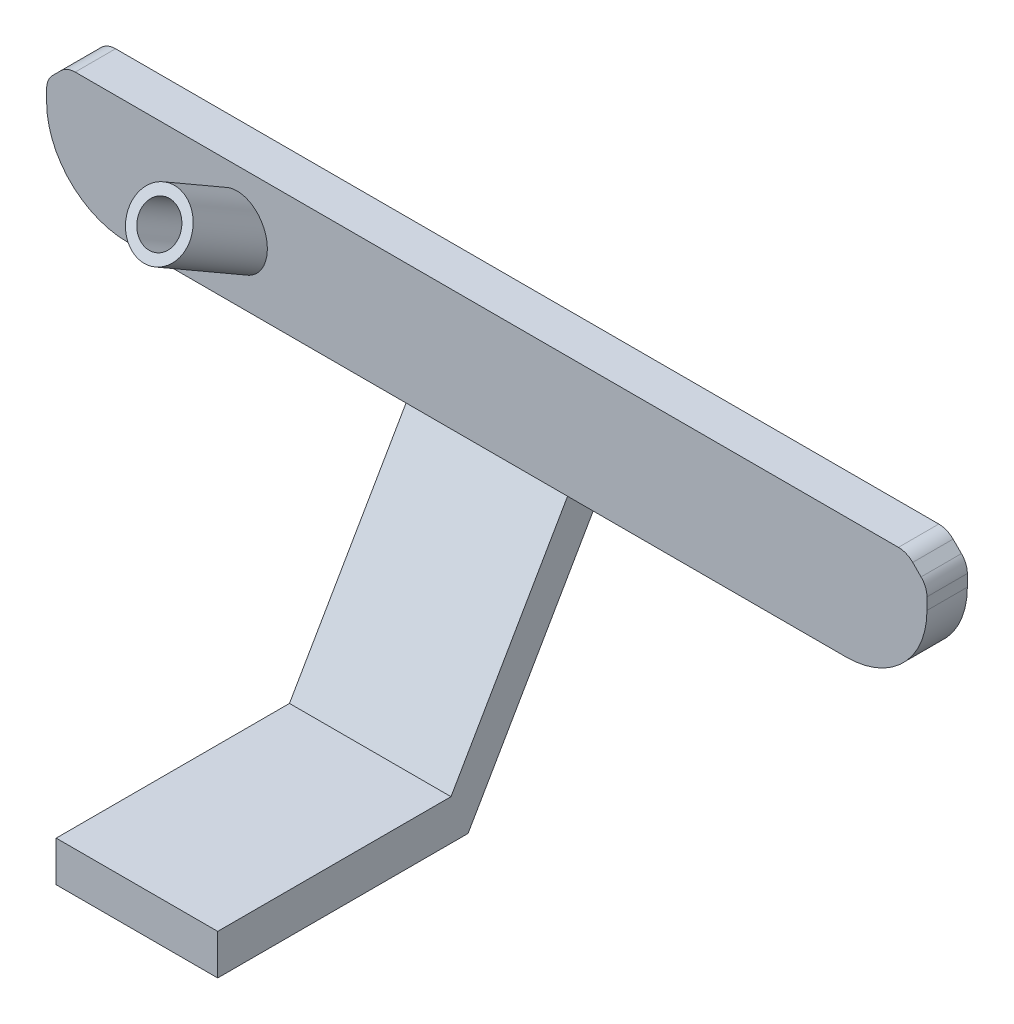
ISO-10303-21;
HEADER;
FILE_DESCRIPTION(('STEP AP214'),'2;1');
FILE_NAME('part.step','',(''),(''),'','','');
FILE_SCHEMA(('AUTOMOTIVE_DESIGN { 1 0 10303 214 1 1 1 1 }'));
ENDSEC;
DATA;
#1=APPLICATION_CONTEXT('core data for automotive mechanical design processes');
#2=APPLICATION_PROTOCOL_DEFINITION('international standard','automotive_design',2000,#1);
#3=PRODUCT_CONTEXT('',#1,'mechanical');
#4=PRODUCT('Part','Part','',(#3));
#5=PRODUCT_RELATED_PRODUCT_CATEGORY('part','',(#4));
#6=PRODUCT_DEFINITION_FORMATION('','',#4);
#7=PRODUCT_DEFINITION_CONTEXT('part definition',#1,'design');
#8=PRODUCT_DEFINITION('design','',#6,#7);
#9=PRODUCT_DEFINITION_SHAPE('','',#8);
#10=(LENGTH_UNIT() NAMED_UNIT(*) SI_UNIT(.MILLI.,.METRE.));
#11=(NAMED_UNIT(*) PLANE_ANGLE_UNIT() SI_UNIT($,.RADIAN.));
#12=(NAMED_UNIT(*) SI_UNIT($,.STERADIAN.) SOLID_ANGLE_UNIT());
#13=UNCERTAINTY_MEASURE_WITH_UNIT(LENGTH_MEASURE(1.E-05),#10,'distance_accuracy_value','');
#14=(GEOMETRIC_REPRESENTATION_CONTEXT(3) GLOBAL_UNCERTAINTY_ASSIGNED_CONTEXT((#13)) GLOBAL_UNIT_ASSIGNED_CONTEXT((#10,
#11,#12)) REPRESENTATION_CONTEXT('',''));
#15=CARTESIAN_POINT('',(0.,0.,0.));
#16=DIRECTION('',(0.,0.,1.));
#17=DIRECTION('',(1.,0.,0.));
#18=AXIS2_PLACEMENT_3D('',#15,#16,#17);
#19=CARTESIAN_POINT('',(109.,-15.,5.));
#20=DIRECTION('',(0.,1.,0.));
#21=DIRECTION('',(-1.,0.,0.));
#22=AXIS2_PLACEMENT_3D('',#19,#20,#21);
#23=PLANE('',#22);
#24=DIRECTION('',(0.,0.,1.));
#25=VECTOR('',#24,1.);
#26=CARTESIAN_POINT('',(20.,-15.,-5.));
#27=LINE('',#26,#25);
#28=CARTESIAN_POINT('',(20.,-15.,-5.));
#29=VERTEX_POINT('',#28);
#30=CARTESIAN_POINT('',(20.,-15.,5.));
#31=VERTEX_POINT('',#30);
#32=EDGE_CURVE('E197',#29,#31,#27,.T.);
#33=ORIENTED_EDGE('',*,*,#32,.F.);
#34=DIRECTION('',(1.,0.,0.));
#35=VECTOR('',#34,1.);
#36=CARTESIAN_POINT('',(109.,-15.,-5.));
#37=LINE('',#36,#35);
#38=CARTESIAN_POINT('',(89.,-15.,-5.));
#39=VERTEX_POINT('',#38);
#40=EDGE_CURVE('E179',#29,#39,#37,.T.);
#41=ORIENTED_EDGE('',*,*,#40,.T.);
#42=DIRECTION('',(0.,0.,-1.));
#43=VECTOR('',#42,1.);
#44=CARTESIAN_POINT('',(89.,-15.,5.));
#45=LINE('',#44,#43);
#46=CARTESIAN_POINT('',(89.,-15.,5.));
#47=VERTEX_POINT('',#46);
#48=EDGE_CURVE('E292',#39,#47,#45,.F.);
#49=ORIENTED_EDGE('',*,*,#48,.T.);
#50=DIRECTION('',(1.,0.,0.));
#51=VECTOR('',#50,1.);
#52=CARTESIAN_POINT('',(109.,-15.,5.));
#53=LINE('',#52,#51);
#54=EDGE_CURVE('E199',#31,#47,#53,.T.);
#55=ORIENTED_EDGE('',*,*,#54,.F.);
#56=EDGE_LOOP('',(#33,#41,#49,#55));
#57=FACE_BOUND('',#56,.T.);
#58=ADVANCED_FACE('F53',(#57),#23,.F.);
#59=CARTESIAN_POINT('',(-109.,-15.,5.));
#60=DIRECTION('',(1.,0.,0.));
#61=DIRECTION('',(0.,0.,-1.));
#62=AXIS2_PLACEMENT_3D('',#59,#60,#61);
#63=PLANE('',#62);
#64=DIRECTION('',(0.,-1.,0.));
#65=VECTOR('',#64,1.);
#66=CARTESIAN_POINT('',(-109.,-15.,5.));
#67=LINE('',#66,#65);
#68=CARTESIAN_POINT('',(-109.,7.92893218813451,5.));
#69=VERTEX_POINT('',#68);
#70=CARTESIAN_POINT('',(-109.,4.99999999999999,5.));
#71=VERTEX_POINT('',#70);
#72=EDGE_CURVE('E252',#69,#71,#67,.T.);
#73=ORIENTED_EDGE('',*,*,#72,.F.);
#74=DIRECTION('',(0.,0.,1.));
#75=VECTOR('',#74,1.);
#76=CARTESIAN_POINT('',(-109.,7.92893218813451,-5.));
#77=LINE('',#76,#75);
#78=CARTESIAN_POINT('',(-109.,7.92893218813451,-5.));
#79=VERTEX_POINT('',#78);
#80=EDGE_CURVE('E363',#69,#79,#77,.F.);
#81=ORIENTED_EDGE('',*,*,#80,.T.);
#82=DIRECTION('',(0.,-1.,0.));
#83=VECTOR('',#82,1.);
#84=CARTESIAN_POINT('',(-109.,-15.,-5.));
#85=LINE('',#84,#83);
#86=CARTESIAN_POINT('',(-109.,4.99999999999999,-5.));
#87=VERTEX_POINT('',#86);
#88=EDGE_CURVE('E194',#79,#87,#85,.T.);
#89=ORIENTED_EDGE('',*,*,#88,.T.);
#90=DIRECTION('',(0.,0.,-1.));
#91=VECTOR('',#90,1.);
#92=CARTESIAN_POINT('',(-109.,4.99999999999999,5.));
#93=LINE('',#92,#91);
#94=EDGE_CURVE('E301',#87,#71,#93,.F.);
#95=ORIENTED_EDGE('',*,*,#94,.T.);
#96=EDGE_LOOP('',(#73,#81,#89,#95));
#97=FACE_BOUND('',#96,.T.);
#98=ADVANCED_FACE('F536',(#97),#63,.F.);
#99=CARTESIAN_POINT('',(-89.,-15.,-5.));
#100=VERTEX_POINT('',#99);
#101=CARTESIAN_POINT('',(-20.,-15.,-5.));
#102=VERTEX_POINT('',#101);
#103=EDGE_CURVE('E193',#100,#102,#37,.T.);
#104=ORIENTED_EDGE('',*,*,#103,.T.);
#105=DIRECTION('',(0.,0.,1.));
#106=VECTOR('',#105,1.);
#107=CARTESIAN_POINT('',(-20.,-15.,-5.));
#108=LINE('',#107,#106);
#109=CARTESIAN_POINT('',(-20.,-15.,5.));
#110=VERTEX_POINT('',#109);
#111=EDGE_CURVE('E491',#102,#110,#108,.T.);
#112=ORIENTED_EDGE('',*,*,#111,.T.);
#113=CARTESIAN_POINT('',(-89.,-15.,5.));
#114=VERTEX_POINT('',#113);
#115=EDGE_CURVE('E256',#114,#110,#53,.T.);
#116=ORIENTED_EDGE('',*,*,#115,.F.);
#117=DIRECTION('',(0.,0.,-1.));
#118=VECTOR('',#117,1.);
#119=CARTESIAN_POINT('',(-89.,-15.,5.));
#120=LINE('',#119,#118);
#121=EDGE_CURVE('E288',#114,#100,#120,.T.);
#122=ORIENTED_EDGE('',*,*,#121,.T.);
#123=EDGE_LOOP('',(#104,#112,#116,#122));
#124=FACE_BOUND('',#123,.T.);
#125=ADVANCED_FACE('F504',(#124),#23,.F.);
#126=CARTESIAN_POINT('',(109.,-15.,5.));
#127=DIRECTION('',(-1.,0.,0.));
#128=DIRECTION('',(0.,0.,1.));
#129=AXIS2_PLACEMENT_3D('',#126,#127,#128);
#130=PLANE('',#129);
#131=DIRECTION('',(0.,1.,0.));
#132=VECTOR('',#131,1.);
#133=CARTESIAN_POINT('',(109.,-15.,-5.));
#134=LINE('',#133,#132);
#135=CARTESIAN_POINT('',(109.,5.00000000000001,-5.));
#136=VERTEX_POINT('',#135);
#137=CARTESIAN_POINT('',(109.,7.92893218813452,-5.));
#138=VERTEX_POINT('',#137);
#139=EDGE_CURVE('E272',#136,#138,#134,.T.);
#140=ORIENTED_EDGE('',*,*,#139,.T.);
#141=DIRECTION('',(0.,0.,-1.));
#142=VECTOR('',#141,1.);
#143=CARTESIAN_POINT('',(109.,7.92893218813452,5.));
#144=LINE('',#143,#142);
#145=CARTESIAN_POINT('',(109.,7.92893218813452,5.));
#146=VERTEX_POINT('',#145);
#147=EDGE_CURVE('E360',#138,#146,#144,.F.);
#148=ORIENTED_EDGE('',*,*,#147,.T.);
#149=DIRECTION('',(0.,1.,0.));
#150=VECTOR('',#149,1.);
#151=CARTESIAN_POINT('',(109.,-15.,5.));
#152=LINE('',#151,#150);
#153=CARTESIAN_POINT('',(109.,5.00000000000001,5.));
#154=VERTEX_POINT('',#153);
#155=EDGE_CURVE('E260',#154,#146,#152,.T.);
#156=ORIENTED_EDGE('',*,*,#155,.F.);
#157=DIRECTION('',(0.,0.,-1.));
#158=VECTOR('',#157,1.);
#159=CARTESIAN_POINT('',(109.,5.00000000000001,5.));
#160=LINE('',#159,#158);
#161=EDGE_CURVE('E268',#154,#136,#160,.T.);
#162=ORIENTED_EDGE('',*,*,#161,.T.);
#163=EDGE_LOOP('',(#140,#148,#156,#162));
#164=FACE_BOUND('',#163,.T.);
#165=ADVANCED_FACE('F395',(#164),#130,.F.);
#166=CARTESIAN_POINT('',(109.,15.,5.));
#167=DIRECTION('',(0.,-1.,0.));
#168=DIRECTION('',(1.,0.,0.));
#169=AXIS2_PLACEMENT_3D('',#166,#167,#168);
#170=PLANE('',#169);
#171=DIRECTION('',(-1.,0.,0.));
#172=VECTOR('',#171,1.);
#173=CARTESIAN_POINT('',(109.,15.,5.));
#174=LINE('',#173,#172);
#175=CARTESIAN_POINT('',(101.928932188134,15.,5.));
#176=VERTEX_POINT('',#175);
#177=CARTESIAN_POINT('',(-101.928932188135,15.,5.));
#178=VERTEX_POINT('',#177);
#179=EDGE_CURVE('E264',#176,#178,#174,.T.);
#180=ORIENTED_EDGE('',*,*,#179,.F.);
#181=DIRECTION('',(0.,0.,1.));
#182=VECTOR('',#181,1.);
#183=CARTESIAN_POINT('',(101.928932188134,15.,-5.));
#184=LINE('',#183,#182);
#185=CARTESIAN_POINT('',(101.928932188134,15.,-5.));
#186=VERTEX_POINT('',#185);
#187=EDGE_CURVE('E328',#176,#186,#184,.F.);
#188=ORIENTED_EDGE('',*,*,#187,.T.);
#189=DIRECTION('',(-1.,0.,0.));
#190=VECTOR('',#189,1.);
#191=CARTESIAN_POINT('',(109.,15.,-5.));
#192=LINE('',#191,#190);
#193=CARTESIAN_POINT('',(-101.928932188135,15.,-5.));
#194=VERTEX_POINT('',#193);
#195=EDGE_CURVE('E255',#186,#194,#192,.T.);
#196=ORIENTED_EDGE('',*,*,#195,.T.);
#197=DIRECTION('',(0.,0.,-1.));
#198=VECTOR('',#197,1.);
#199=CARTESIAN_POINT('',(-101.928932188135,15.,5.));
#200=LINE('',#199,#198);
#201=EDGE_CURVE('E324',#194,#178,#200,.F.);
#202=ORIENTED_EDGE('',*,*,#201,.T.);
#203=EDGE_LOOP('',(#180,#188,#196,#202));
#204=FACE_BOUND('',#203,.T.);
#205=ADVANCED_FACE('F381',(#204),#170,.F.);
#206=CARTESIAN_POINT('',(0.,0.,5.));
#207=DIRECTION('',(0.,0.,1.));
#208=DIRECTION('',(1.,0.,0.));
#209=AXIS2_PLACEMENT_3D('',#206,#207,#208);
#210=PLANE('',#209);
#211=CARTESIAN_POINT('',(-61.85,0.886751345948124,5.));
#212=DIRECTION('',(0.,0.,1.));
#213=DIRECTION('',(0.,1.,0.));
#214=AXIS2_PLACEMENT_3D('',#211,#212,#213);
#215=ELLIPSE('',#214,8.66025403784438,7.5);
#216=CARTESIAN_POINT('',(-61.85,9.5470053837925,5.));
#217=VERTEX_POINT('',#216);
#218=EDGE_CURVE('E248',#217,#217,#215,.F.);
#219=ORIENTED_EDGE('',*,*,#218,.T.);
#220=EDGE_LOOP('',(#219));
#221=FACE_BOUND('',#220,.T.);
#222=DIRECTION('',(0.707106781186546,-0.707106781186549,0.));
#223=VECTOR('',#222,1.);
#224=CARTESIAN_POINT('',(59.5000000000003,59.5,5.));
#225=LINE('',#224,#223);
#226=CARTESIAN_POINT('',(107.535533905933,11.4644660940672,5.));
#227=VERTEX_POINT('',#226);
#228=CARTESIAN_POINT('',(105.464466094067,13.5355339059327,5.));
#229=VERTEX_POINT('',#228);
#230=EDGE_CURVE('E317',#227,#229,#225,.F.);
#231=ORIENTED_EDGE('',*,*,#230,.T.);
#232=CARTESIAN_POINT('',(101.928932188134,10.,5.));
#233=DIRECTION('',(0.,0.,1.));
#234=DIRECTION('',(1.,0.,0.));
#235=AXIS2_PLACEMENT_3D('',#232,#233,#234);
#236=CIRCLE('',#235,5.);
#237=EDGE_CURVE('E357',#229,#176,#236,.T.);
#238=ORIENTED_EDGE('',*,*,#237,.T.);
#239=ORIENTED_EDGE('',*,*,#179,.T.);
#240=CARTESIAN_POINT('',(-101.928932188135,9.99999999999999,5.));
#241=DIRECTION('',(0.,0.,1.));
#242=DIRECTION('',(1.,0.,0.));
#243=AXIS2_PLACEMENT_3D('',#240,#241,#242);
#244=CIRCLE('',#243,5.);
#245=CARTESIAN_POINT('',(-105.464466094067,13.5355339059327,5.));
#246=VERTEX_POINT('',#245);
#247=EDGE_CURVE('E350',#178,#246,#244,.T.);
#248=ORIENTED_EDGE('',*,*,#247,.T.);
#249=DIRECTION('',(0.707106781186549,0.707106781186546,0.));
#250=VECTOR('',#249,1.);
#251=CARTESIAN_POINT('',(-59.4999999999997,59.5,5.));
#252=LINE('',#251,#250);
#253=CARTESIAN_POINT('',(-107.535533905933,11.4644660940673,5.));
#254=VERTEX_POINT('',#253);
#255=EDGE_CURVE('E321',#246,#254,#252,.F.);
#256=ORIENTED_EDGE('',*,*,#255,.T.);
#257=CARTESIAN_POINT('',(-104.,7.92893218813451,5.));
#258=DIRECTION('',(0.,0.,1.));
#259=DIRECTION('',(1.,0.,0.));
#260=AXIS2_PLACEMENT_3D('',#257,#258,#259);
#261=CIRCLE('',#260,5.);
#262=EDGE_CURVE('E77',#254,#69,#261,.T.);
#263=ORIENTED_EDGE('',*,*,#262,.T.);
#264=ORIENTED_EDGE('',*,*,#72,.T.);
#265=CARTESIAN_POINT('',(-89.,4.99999999999999,5.));
#266=DIRECTION('',(0.,0.,1.));
#267=DIRECTION('',(1.,0.,0.));
#268=AXIS2_PLACEMENT_3D('',#265,#266,#267);
#269=CIRCLE('',#268,20.);
#270=EDGE_CURVE('E295',#71,#114,#269,.T.);
#271=ORIENTED_EDGE('',*,*,#270,.T.);
#272=ORIENTED_EDGE('',*,*,#115,.T.);
#273=DIRECTION('',(-1.,0.,0.));
#274=VECTOR('',#273,1.);
#275=CARTESIAN_POINT('',(20.,-15.,5.));
#276=LINE('',#275,#274);
#277=EDGE_CURVE('E223',#31,#110,#276,.T.);
#278=ORIENTED_EDGE('',*,*,#277,.F.);
#279=ORIENTED_EDGE('',*,*,#54,.T.);
#280=CARTESIAN_POINT('',(89.,5.00000000000001,5.));
#281=DIRECTION('',(0.,0.,1.));
#282=DIRECTION('',(1.,0.,0.));
#283=AXIS2_PLACEMENT_3D('',#280,#281,#282);
#284=CIRCLE('',#283,20.);
#285=EDGE_CURVE('E298',#47,#154,#284,.T.);
#286=ORIENTED_EDGE('',*,*,#285,.T.);
#287=ORIENTED_EDGE('',*,*,#155,.T.);
#288=CARTESIAN_POINT('',(104.,7.92893218813452,5.));
#289=DIRECTION('',(0.,0.,1.));
#290=DIRECTION('',(1.,0.,0.));
#291=AXIS2_PLACEMENT_3D('',#288,#289,#290);
#292=CIRCLE('',#291,5.);
#293=EDGE_CURVE('E69',#146,#227,#292,.T.);
#294=ORIENTED_EDGE('',*,*,#293,.T.);
#295=EDGE_LOOP('',(#231,#238,#239,#248,#256,#263,#264,#271,#272,#278,#279,#286,#287,#294));
#296=FACE_BOUND('',#295,.T.);
#297=ADVANCED_FACE('F383',(#221,#296),#210,.T.);
#298=CARTESIAN_POINT('',(0.,0.,-5.));
#299=DIRECTION('',(0.,0.,1.));
#300=DIRECTION('',(1.,0.,0.));
#301=AXIS2_PLACEMENT_3D('',#298,#299,#300);
#302=PLANE('',#301);
#303=CARTESIAN_POINT('',(-61.85,-4.8867513459481,-5.));
#304=DIRECTION('',(0.,0.,1.));
#305=DIRECTION('',(0.,1.,0.));
#306=AXIS2_PLACEMENT_3D('',#303,#304,#305);
#307=ELLIPSE('',#306,8.66025403784438,7.5);
#308=CARTESIAN_POINT('',(-61.85,3.77350269189628,-5.));
#309=VERTEX_POINT('',#308);
#310=EDGE_CURVE('E305',#309,#309,#307,.F.);
#311=ORIENTED_EDGE('',*,*,#310,.F.);
#312=EDGE_LOOP('',(#311));
#313=FACE_BOUND('',#312,.T.);
#314=ORIENTED_EDGE('',*,*,#195,.F.);
#315=CARTESIAN_POINT('',(101.928932188134,10.,-5.));
#316=DIRECTION('',(0.,0.,1.));
#317=DIRECTION('',(1.,0.,0.));
#318=AXIS2_PLACEMENT_3D('',#315,#316,#317);
#319=CIRCLE('',#318,5.);
#320=CARTESIAN_POINT('',(105.464466094067,13.5355339059327,-5.));
#321=VERTEX_POINT('',#320);
#322=EDGE_CURVE('E341',#186,#321,#319,.F.);
#323=ORIENTED_EDGE('',*,*,#322,.T.);
#324=DIRECTION('',(-0.707106781186546,0.707106781186549,0.));
#325=VECTOR('',#324,1.);
#326=CARTESIAN_POINT('',(104.,15.,-5.));
#327=LINE('',#326,#325);
#328=CARTESIAN_POINT('',(107.535533905933,11.4644660940672,-5.));
#329=VERTEX_POINT('',#328);
#330=EDGE_CURVE('E309',#321,#329,#327,.F.);
#331=ORIENTED_EDGE('',*,*,#330,.T.);
#332=CARTESIAN_POINT('',(104.,7.92893218813452,-5.));
#333=DIRECTION('',(0.,0.,1.));
#334=DIRECTION('',(1.,0.,0.));
#335=AXIS2_PLACEMENT_3D('',#332,#333,#334);
#336=CIRCLE('',#335,5.);
#337=EDGE_CURVE('E338',#329,#138,#336,.F.);
#338=ORIENTED_EDGE('',*,*,#337,.T.);
#339=ORIENTED_EDGE('',*,*,#139,.F.);
#340=CARTESIAN_POINT('',(89.,5.00000000000001,-5.));
#341=DIRECTION('',(0.,0.,1.));
#342=DIRECTION('',(1.,0.,0.));
#343=AXIS2_PLACEMENT_3D('',#340,#341,#342);
#344=CIRCLE('',#343,20.);
#345=EDGE_CURVE('E188',#136,#39,#344,.F.);
#346=ORIENTED_EDGE('',*,*,#345,.T.);
#347=ORIENTED_EDGE('',*,*,#40,.F.);
#348=DIRECTION('',(-1.,0.,0.));
#349=VECTOR('',#348,1.);
#350=CARTESIAN_POINT('',(20.,-15.,-5.));
#351=LINE('',#350,#349);
#352=EDGE_CURVE('E185',#29,#102,#351,.T.);
#353=ORIENTED_EDGE('',*,*,#352,.T.);
#354=ORIENTED_EDGE('',*,*,#103,.F.);
#355=CARTESIAN_POINT('',(-89.,4.99999999999999,-5.));
#356=DIRECTION('',(0.,0.,1.));
#357=DIRECTION('',(1.,0.,0.));
#358=AXIS2_PLACEMENT_3D('',#355,#356,#357);
#359=CIRCLE('',#358,20.);
#360=EDGE_CURVE('E282',#100,#87,#359,.F.);
#361=ORIENTED_EDGE('',*,*,#360,.T.);
#362=ORIENTED_EDGE('',*,*,#88,.F.);
#363=CARTESIAN_POINT('',(-104.,7.92893218813451,-5.));
#364=DIRECTION('',(0.,0.,1.));
#365=DIRECTION('',(1.,0.,0.));
#366=AXIS2_PLACEMENT_3D('',#363,#364,#365);
#367=CIRCLE('',#366,5.);
#368=CARTESIAN_POINT('',(-107.535533905933,11.4644660940673,-5.));
#369=VERTEX_POINT('',#368);
#370=EDGE_CURVE('E335',#79,#369,#367,.F.);
#371=ORIENTED_EDGE('',*,*,#370,.T.);
#372=DIRECTION('',(-0.707106781186549,-0.707106781186546,0.));
#373=VECTOR('',#372,1.);
#374=CARTESIAN_POINT('',(-109.,9.99999999999998,-5.));
#375=LINE('',#374,#373);
#376=CARTESIAN_POINT('',(-105.464466094067,13.5355339059327,-5.));
#377=VERTEX_POINT('',#376);
#378=EDGE_CURVE('E313',#369,#377,#375,.F.);
#379=ORIENTED_EDGE('',*,*,#378,.T.);
#380=CARTESIAN_POINT('',(-101.928932188135,9.99999999999999,-5.));
#381=DIRECTION('',(0.,0.,1.));
#382=DIRECTION('',(1.,0.,0.));
#383=AXIS2_PLACEMENT_3D('',#380,#381,#382);
#384=CIRCLE('',#383,5.);
#385=EDGE_CURVE('E332',#377,#194,#384,.F.);
#386=ORIENTED_EDGE('',*,*,#385,.T.);
#387=EDGE_LOOP('',(#314,#323,#331,#338,#339,#346,#347,#353,#354,#361,#362,#371,#379,#386));
#388=FACE_BOUND('',#387,.T.);
#389=ADVANCED_FACE('F182',(#313,#388),#302,.F.);
#390=CARTESIAN_POINT('',(89.,5.00000000000001,5.));
#391=DIRECTION('',(0.,0.,-1.));
#392=DIRECTION('',(-1.,0.,0.));
#393=AXIS2_PLACEMENT_3D('',#390,#391,#392);
#394=CYLINDRICAL_SURFACE('',#393,20.);
#395=ORIENTED_EDGE('',*,*,#285,.F.);
#396=ORIENTED_EDGE('',*,*,#48,.F.);
#397=ORIENTED_EDGE('',*,*,#345,.F.);
#398=ORIENTED_EDGE('',*,*,#161,.F.);
#399=EDGE_LOOP('',(#395,#396,#397,#398));
#400=FACE_BOUND('',#399,.T.);
#401=ADVANCED_FACE('F400',(#400),#394,.T.);
#402=CARTESIAN_POINT('',(-89.,4.99999999999999,5.));
#403=DIRECTION('',(0.,0.,-1.));
#404=DIRECTION('',(-1.,0.,0.));
#405=AXIS2_PLACEMENT_3D('',#402,#403,#404);
#406=CYLINDRICAL_SURFACE('',#405,20.);
#407=ORIENTED_EDGE('',*,*,#270,.F.);
#408=ORIENTED_EDGE('',*,*,#94,.F.);
#409=ORIENTED_EDGE('',*,*,#360,.F.);
#410=ORIENTED_EDGE('',*,*,#121,.F.);
#411=EDGE_LOOP('',(#407,#408,#409,#410));
#412=FACE_BOUND('',#411,.T.);
#413=ADVANCED_FACE('F569',(#412),#406,.T.);
#414=CARTESIAN_POINT('',(-61.85,-1.50480947161665,-14.1423048454133));
#415=DIRECTION('',(0.,0.499999999999998,0.86602540378444));
#416=DIRECTION('',(0.,-0.86602540378444,0.499999999999998));
#417=AXIS2_PLACEMENT_3D('',#414,#415,#416);
#418=PLANE('',#417);
#419=CARTESIAN_POINT('',(-61.85,-7.99999999999996,-10.3923048454133));
#420=DIRECTION('',(0.,0.499999999999998,0.86602540378444));
#421=DIRECTION('',(0.,-0.86602540378444,0.499999999999998));
#422=AXIS2_PLACEMENT_3D('',#419,#420,#421);
#423=CIRCLE('',#422,5.);
#424=CARTESIAN_POINT('',(-61.85,-12.3301270189222,-7.89230484541329));
#425=VERTEX_POINT('',#424);
#426=EDGE_CURVE('E230',#425,#425,#423,.T.);
#427=ORIENTED_EDGE('',*,*,#426,.T.);
#428=EDGE_LOOP('',(#427));
#429=FACE_BOUND('',#428,.T.);
#430=CARTESIAN_POINT('',(-61.85,-7.99999999999996,-10.3923048454133));
#431=DIRECTION('',(0.,0.499999999999998,0.86602540378444));
#432=DIRECTION('',(0.,-0.86602540378444,0.499999999999998));
#433=AXIS2_PLACEMENT_3D('',#430,#431,#432);
#434=CIRCLE('',#433,7.50000000000001);
#435=CARTESIAN_POINT('',(-61.85,-14.4951905283833,-6.6423048454133));
#436=VERTEX_POINT('',#435);
#437=EDGE_CURVE('E244',#436,#436,#434,.T.);
#438=ORIENTED_EDGE('',*,*,#437,.F.);
#439=EDGE_LOOP('',(#438));
#440=FACE_BOUND('',#439,.T.);
#441=ADVANCED_FACE('F566',(#429,#440),#418,.F.);
#442=CARTESIAN_POINT('',(-61.85,12.,24.2487113059643));
#443=DIRECTION('',(0.,0.499999999999998,0.86602540378444));
#444=DIRECTION('',(0.,-0.86602540378444,0.499999999999998));
#445=AXIS2_PLACEMENT_3D('',#442,#443,#444);
#446=CYLINDRICAL_SURFACE('',#445,7.5);
#447=ORIENTED_EDGE('',*,*,#437,.T.);
#448=EDGE_LOOP('',(#447));
#449=FACE_BOUND('',#448,.T.);
#450=ORIENTED_EDGE('',*,*,#310,.T.);
#451=EDGE_LOOP('',(#450));
#452=FACE_BOUND('',#451,.T.);
#453=ADVANCED_FACE('F564',(#449,#452),#446,.T.);
#454=ORIENTED_EDGE('',*,*,#218,.F.);
#455=EDGE_LOOP('',(#454));
#456=FACE_BOUND('',#455,.T.);
#457=CARTESIAN_POINT('',(-61.85,11.9999999999999,24.2487113059643));
#458=DIRECTION('',(0.,0.499999999999998,0.86602540378444));
#459=DIRECTION('',(0.,-0.86602540378444,0.499999999999998));
#460=AXIS2_PLACEMENT_3D('',#457,#458,#459);
#461=CIRCLE('',#460,7.5);
#462=CARTESIAN_POINT('',(-61.85,5.50480947161665,27.9987113059643));
#463=VERTEX_POINT('',#462);
#464=EDGE_CURVE('E240',#463,#463,#461,.T.);
#465=ORIENTED_EDGE('',*,*,#464,.F.);
#466=EDGE_LOOP('',(#465));
#467=FACE_BOUND('',#466,.T.);
#468=ADVANCED_FACE('F560',(#456,#467),#446,.T.);
#469=CARTESIAN_POINT('',(-61.85,18.4951905283832,20.4987113059643));
#470=DIRECTION('',(0.,-0.499999999999998,-0.86602540378444));
#471=DIRECTION('',(0.,0.86602540378444,-0.499999999999998));
#472=AXIS2_PLACEMENT_3D('',#469,#470,#471);
#473=PLANE('',#472);
#474=CARTESIAN_POINT('',(-61.85,12.,24.2487113059643));
#475=DIRECTION('',(0.,0.499999999999998,0.86602540378444));
#476=DIRECTION('',(0.,-0.86602540378444,0.499999999999998));
#477=AXIS2_PLACEMENT_3D('',#474,#475,#476);
#478=CIRCLE('',#477,5.);
#479=CARTESIAN_POINT('',(-61.85,7.66987298107775,26.7487113059643));
#480=VERTEX_POINT('',#479);
#481=EDGE_CURVE('E222',#480,#480,#478,.T.);
#482=ORIENTED_EDGE('',*,*,#481,.F.);
#483=EDGE_LOOP('',(#482));
#484=FACE_BOUND('',#483,.T.);
#485=ORIENTED_EDGE('',*,*,#464,.T.);
#486=EDGE_LOOP('',(#485));
#487=FACE_BOUND('',#486,.T.);
#488=ADVANCED_FACE('F563',(#484,#487),#473,.F.);
#489=CARTESIAN_POINT('',(-61.85,-11.3737976320958,-16.2358937586588));
#490=DIRECTION('',(0.,0.499999999999998,0.86602540378444));
#491=DIRECTION('',(0.,-0.86602540378444,0.499999999999998));
#492=AXIS2_PLACEMENT_3D('',#489,#490,#491);
#493=CYLINDRICAL_SURFACE('',#492,5.);
#494=ORIENTED_EDGE('',*,*,#481,.T.);
#495=EDGE_LOOP('',(#494));
#496=FACE_BOUND('',#495,.T.);
#497=ORIENTED_EDGE('',*,*,#426,.F.);
#498=EDGE_LOOP('',(#497));
#499=FACE_BOUND('',#498,.T.);
#500=ADVANCED_FACE('F573',(#496,#499),#493,.F.);
#501=CARTESIAN_POINT('',(20.,-15.,-5.));
#502=DIRECTION('',(0.,0.499999999999998,0.86602540378444));
#503=DIRECTION('',(0.,-0.86602540378444,0.499999999999998));
#504=AXIS2_PLACEMENT_3D('',#501,#502,#503);
#505=PLANE('',#504);
#506=DIRECTION('',(0.,0.86602540378444,-0.499999999999998));
#507=VECTOR('',#506,1.);
#508=CARTESIAN_POINT('',(-20.,-15.,-5.));
#509=LINE('',#508,#507);
#510=CARTESIAN_POINT('',(-20.,-75.,29.6410161513773));
#511=VERTEX_POINT('',#510);
#512=EDGE_CURVE('E220',#511,#102,#509,.T.);
#513=ORIENTED_EDGE('',*,*,#512,.T.);
#514=ORIENTED_EDGE('',*,*,#352,.F.);
#515=DIRECTION('',(0.,0.86602540378444,-0.499999999999998));
#516=VECTOR('',#515,1.);
#517=CARTESIAN_POINT('',(20.,-15.,-5.));
#518=LINE('',#517,#516);
#519=CARTESIAN_POINT('',(20.,-75.,29.6410161513773));
#520=VERTEX_POINT('',#519);
#521=EDGE_CURVE('E205',#520,#29,#518,.T.);
#522=ORIENTED_EDGE('',*,*,#521,.F.);
#523=DIRECTION('',(-1.,0.,0.));
#524=VECTOR('',#523,1.);
#525=CARTESIAN_POINT('',(20.,-75.,29.6410161513773));
#526=LINE('',#525,#524);
#527=EDGE_CURVE('E445',#520,#511,#526,.T.);
#528=ORIENTED_EDGE('',*,*,#527,.T.);
#529=EDGE_LOOP('',(#513,#514,#522,#528));
#530=FACE_BOUND('',#529,.T.);
#531=ADVANCED_FACE('F218',(#530),#505,.F.);
#532=CARTESIAN_POINT('',(20.,-15.,5.));
#533=DIRECTION('',(0.,-0.499999999999998,-0.86602540378444));
#534=DIRECTION('',(0.,0.86602540378444,-0.499999999999998));
#535=AXIS2_PLACEMENT_3D('',#532,#533,#534);
#536=PLANE('',#535);
#537=DIRECTION('',(0.,-0.86602540378444,0.499999999999998));
#538=VECTOR('',#537,1.);
#539=CARTESIAN_POINT('',(-20.,-15.,5.));
#540=LINE('',#539,#538);
#541=CARTESIAN_POINT('',(-20.,-65.,33.8675134594811));
#542=VERTEX_POINT('',#541);
#543=EDGE_CURVE('E486',#110,#542,#540,.T.);
#544=ORIENTED_EDGE('',*,*,#543,.T.);
#545=DIRECTION('',(-1.,0.,0.));
#546=VECTOR('',#545,1.);
#547=CARTESIAN_POINT('',(20.,-65.,33.8675134594811));
#548=LINE('',#547,#546);
#549=CARTESIAN_POINT('',(20.,-65.,33.8675134594811));
#550=VERTEX_POINT('',#549);
#551=EDGE_CURVE('E233',#550,#542,#548,.T.);
#552=ORIENTED_EDGE('',*,*,#551,.F.);
#553=DIRECTION('',(0.,-0.86602540378444,0.499999999999998));
#554=VECTOR('',#553,1.);
#555=CARTESIAN_POINT('',(20.,-15.,5.));
#556=LINE('',#555,#554);
#557=EDGE_CURVE('E204',#31,#550,#556,.T.);
#558=ORIENTED_EDGE('',*,*,#557,.F.);
#559=ORIENTED_EDGE('',*,*,#277,.T.);
#560=EDGE_LOOP('',(#544,#552,#558,#559));
#561=FACE_BOUND('',#560,.T.);
#562=ADVANCED_FACE('F510',(#561),#536,.F.);
#563=CARTESIAN_POINT('',(20.,-65.,33.8675134594811));
#564=DIRECTION('',(0.,-1.,0.));
#565=DIRECTION('',(0.,0.,-1.));
#566=AXIS2_PLACEMENT_3D('',#563,#564,#565);
#567=PLANE('',#566);
#568=DIRECTION('',(0.,0.,1.));
#569=VECTOR('',#568,1.);
#570=CARTESIAN_POINT('',(-20.,-65.,33.8675134594811));
#571=LINE('',#570,#569);
#572=CARTESIAN_POINT('',(-20.,-65.,91.6410161513773));
#573=VERTEX_POINT('',#572);
#574=EDGE_CURVE('E481',#542,#573,#571,.T.);
#575=ORIENTED_EDGE('',*,*,#574,.T.);
#576=DIRECTION('',(-1.,0.,0.));
#577=VECTOR('',#576,1.);
#578=CARTESIAN_POINT('',(20.,-65.,91.6410161513773));
#579=LINE('',#578,#577);
#580=CARTESIAN_POINT('',(20.,-65.,91.6410161513773));
#581=VERTEX_POINT('',#580);
#582=EDGE_CURVE('E434',#581,#573,#579,.T.);
#583=ORIENTED_EDGE('',*,*,#582,.F.);
#584=DIRECTION('',(0.,0.,1.));
#585=VECTOR('',#584,1.);
#586=CARTESIAN_POINT('',(20.,-65.,33.8675134594811));
#587=LINE('',#586,#585);
#588=EDGE_CURVE('E459',#550,#581,#587,.T.);
#589=ORIENTED_EDGE('',*,*,#588,.F.);
#590=ORIENTED_EDGE('',*,*,#551,.T.);
#591=EDGE_LOOP('',(#575,#583,#589,#590));
#592=FACE_BOUND('',#591,.T.);
#593=ADVANCED_FACE('F518',(#592),#567,.F.);
#594=CARTESIAN_POINT('',(20.,-65.,91.6410161513773));
#595=DIRECTION('',(0.,0.,-1.));
#596=DIRECTION('',(-1.,0.,0.));
#597=AXIS2_PLACEMENT_3D('',#594,#595,#596);
#598=PLANE('',#597);
#599=DIRECTION('',(0.,-1.,0.));
#600=VECTOR('',#599,1.);
#601=CARTESIAN_POINT('',(-20.,-65.,91.6410161513773));
#602=LINE('',#601,#600);
#603=CARTESIAN_POINT('',(-20.,-75.,91.6410161513773));
#604=VERTEX_POINT('',#603);
#605=EDGE_CURVE('E476',#573,#604,#602,.T.);
#606=ORIENTED_EDGE('',*,*,#605,.T.);
#607=DIRECTION('',(-1.,0.,0.));
#608=VECTOR('',#607,1.);
#609=CARTESIAN_POINT('',(20.,-75.,91.6410161513773));
#610=LINE('',#609,#608);
#611=CARTESIAN_POINT('',(20.,-75.,91.6410161513773));
#612=VERTEX_POINT('',#611);
#613=EDGE_CURVE('E439',#612,#604,#610,.T.);
#614=ORIENTED_EDGE('',*,*,#613,.F.);
#615=DIRECTION('',(0.,-1.,0.));
#616=VECTOR('',#615,1.);
#617=CARTESIAN_POINT('',(20.,-65.,91.6410161513773));
#618=LINE('',#617,#616);
#619=EDGE_CURVE('E454',#581,#612,#618,.T.);
#620=ORIENTED_EDGE('',*,*,#619,.F.);
#621=ORIENTED_EDGE('',*,*,#582,.T.);
#622=EDGE_LOOP('',(#606,#614,#620,#621));
#623=FACE_BOUND('',#622,.T.);
#624=ADVANCED_FACE('F522',(#623),#598,.F.);
#625=CARTESIAN_POINT('',(20.,-75.,29.6410161513773));
#626=DIRECTION('',(0.,1.,0.));
#627=DIRECTION('',(0.,0.,1.));
#628=AXIS2_PLACEMENT_3D('',#625,#626,#627);
#629=PLANE('',#628);
#630=DIRECTION('',(0.,0.,-1.));
#631=VECTOR('',#630,1.);
#632=CARTESIAN_POINT('',(-20.,-75.,29.6410161513773));
#633=LINE('',#632,#631);
#634=EDGE_CURVE('E215',#604,#511,#633,.T.);
#635=ORIENTED_EDGE('',*,*,#634,.T.);
#636=ORIENTED_EDGE('',*,*,#527,.F.);
#637=DIRECTION('',(0.,0.,-1.));
#638=VECTOR('',#637,1.);
#639=CARTESIAN_POINT('',(20.,-75.,29.6410161513773));
#640=LINE('',#639,#638);
#641=EDGE_CURVE('E210',#612,#520,#640,.T.);
#642=ORIENTED_EDGE('',*,*,#641,.F.);
#643=ORIENTED_EDGE('',*,*,#613,.T.);
#644=EDGE_LOOP('',(#635,#636,#642,#643));
#645=FACE_BOUND('',#644,.T.);
#646=ADVANCED_FACE('F525',(#645),#629,.F.);
#647=CARTESIAN_POINT('',(20.,0.,0.));
#648=DIRECTION('',(-1.,0.,0.));
#649=DIRECTION('',(0.,0.,1.));
#650=AXIS2_PLACEMENT_3D('',#647,#648,#649);
#651=PLANE('',#650);
#652=ORIENTED_EDGE('',*,*,#521,.T.);
#653=ORIENTED_EDGE('',*,*,#32,.T.);
#654=ORIENTED_EDGE('',*,*,#557,.T.);
#655=ORIENTED_EDGE('',*,*,#588,.T.);
#656=ORIENTED_EDGE('',*,*,#619,.T.);
#657=ORIENTED_EDGE('',*,*,#641,.T.);
#658=EDGE_LOOP('',(#652,#653,#654,#655,#656,#657));
#659=FACE_BOUND('',#658,.T.);
#660=ADVANCED_FACE('F208',(#659),#651,.F.);
#661=CARTESIAN_POINT('',(-20.,0.,0.));
#662=DIRECTION('',(-1.,0.,0.));
#663=DIRECTION('',(0.,0.,1.));
#664=AXIS2_PLACEMENT_3D('',#661,#662,#663);
#665=PLANE('',#664);
#666=ORIENTED_EDGE('',*,*,#512,.F.);
#667=ORIENTED_EDGE('',*,*,#634,.F.);
#668=ORIENTED_EDGE('',*,*,#605,.F.);
#669=ORIENTED_EDGE('',*,*,#574,.F.);
#670=ORIENTED_EDGE('',*,*,#543,.F.);
#671=ORIENTED_EDGE('',*,*,#111,.F.);
#672=EDGE_LOOP('',(#666,#667,#668,#669,#670,#671));
#673=FACE_BOUND('',#672,.T.);
#674=ADVANCED_FACE('F513',(#673),#665,.T.);
#675=CARTESIAN_POINT('',(-109.,9.99999999999998,5.));
#676=DIRECTION('',(0.707106781186545,-0.707106781186549,0.));
#677=DIRECTION('',(0.,0.,-1.));
#678=AXIS2_PLACEMENT_3D('',#675,#676,#677);
#679=PLANE('',#678);
#680=ORIENTED_EDGE('',*,*,#378,.F.);
#681=DIRECTION('',(0.,0.,-1.));
#682=VECTOR('',#681,1.);
#683=CARTESIAN_POINT('',(-107.535533905933,11.4644660940673,5.));
#684=LINE('',#683,#682);
#685=EDGE_CURVE('E11',#369,#254,#684,.F.);
#686=ORIENTED_EDGE('',*,*,#685,.T.);
#687=ORIENTED_EDGE('',*,*,#255,.F.);
#688=DIRECTION('',(0.,0.,1.));
#689=VECTOR('',#688,1.);
#690=CARTESIAN_POINT('',(-105.464466094067,13.5355339059327,-5.));
#691=LINE('',#690,#689);
#692=EDGE_CURVE('E62',#246,#377,#691,.F.);
#693=ORIENTED_EDGE('',*,*,#692,.T.);
#694=EDGE_LOOP('',(#680,#686,#687,#693));
#695=FACE_BOUND('',#694,.T.);
#696=ADVANCED_FACE('F373',(#695),#679,.F.);
#697=CARTESIAN_POINT('',(104.,15.,5.));
#698=DIRECTION('',(-0.707106781186549,-0.707106781186545,0.));
#699=DIRECTION('',(0.,0.,-1.));
#700=AXIS2_PLACEMENT_3D('',#697,#698,#699);
#701=PLANE('',#700);
#702=ORIENTED_EDGE('',*,*,#330,.F.);
#703=DIRECTION('',(0.,0.,-1.));
#704=VECTOR('',#703,1.);
#705=CARTESIAN_POINT('',(105.464466094067,13.5355339059327,5.));
#706=LINE('',#705,#704);
#707=EDGE_CURVE('E347',#321,#229,#706,.F.);
#708=ORIENTED_EDGE('',*,*,#707,.T.);
#709=ORIENTED_EDGE('',*,*,#230,.F.);
#710=DIRECTION('',(0.,0.,1.));
#711=VECTOR('',#710,1.);
#712=CARTESIAN_POINT('',(107.535533905933,11.4644660940672,-5.));
#713=LINE('',#712,#711);
#714=EDGE_CURVE('E344',#227,#329,#713,.F.);
#715=ORIENTED_EDGE('',*,*,#714,.T.);
#716=EDGE_LOOP('',(#702,#708,#709,#715));
#717=FACE_BOUND('',#716,.T.);
#718=ADVANCED_FACE('F392',(#717),#701,.F.);
#719=CARTESIAN_POINT('',(101.928932188134,10.,5.));
#720=DIRECTION('',(0.,0.,-1.));
#721=DIRECTION('',(-1.,0.,0.));
#722=AXIS2_PLACEMENT_3D('',#719,#720,#721);
#723=CYLINDRICAL_SURFACE('',#722,5.);
#724=ORIENTED_EDGE('',*,*,#237,.F.);
#725=ORIENTED_EDGE('',*,*,#707,.F.);
#726=ORIENTED_EDGE('',*,*,#322,.F.);
#727=ORIENTED_EDGE('',*,*,#187,.F.);
#728=EDGE_LOOP('',(#724,#725,#726,#727));
#729=FACE_BOUND('',#728,.T.);
#730=ADVANCED_FACE('F388',(#729),#723,.T.);
#731=CARTESIAN_POINT('',(104.,7.92893218813452,5.));
#732=DIRECTION('',(0.,0.,1.));
#733=DIRECTION('',(1.,0.,0.));
#734=AXIS2_PLACEMENT_3D('',#731,#732,#733);
#735=CYLINDRICAL_SURFACE('',#734,5.);
#736=ORIENTED_EDGE('',*,*,#337,.F.);
#737=ORIENTED_EDGE('',*,*,#714,.F.);
#738=ORIENTED_EDGE('',*,*,#293,.F.);
#739=ORIENTED_EDGE('',*,*,#147,.F.);
#740=EDGE_LOOP('',(#736,#737,#738,#739));
#741=FACE_BOUND('',#740,.T.);
#742=ADVANCED_FACE('F393',(#741),#735,.T.);
#743=CARTESIAN_POINT('',(-104.,7.92893218813451,5.));
#744=DIRECTION('',(0.,0.,-1.));
#745=DIRECTION('',(-1.,0.,0.));
#746=AXIS2_PLACEMENT_3D('',#743,#744,#745);
#747=CYLINDRICAL_SURFACE('',#746,5.);
#748=ORIENTED_EDGE('',*,*,#262,.F.);
#749=ORIENTED_EDGE('',*,*,#685,.F.);
#750=ORIENTED_EDGE('',*,*,#370,.F.);
#751=ORIENTED_EDGE('',*,*,#80,.F.);
#752=EDGE_LOOP('',(#748,#749,#750,#751));
#753=FACE_BOUND('',#752,.T.);
#754=ADVANCED_FACE('F645',(#753),#747,.T.);
#755=CARTESIAN_POINT('',(-101.928932188135,9.99999999999999,5.));
#756=DIRECTION('',(0.,0.,1.));
#757=DIRECTION('',(1.,0.,0.));
#758=AXIS2_PLACEMENT_3D('',#755,#756,#757);
#759=CYLINDRICAL_SURFACE('',#758,5.);
#760=ORIENTED_EDGE('',*,*,#385,.F.);
#761=ORIENTED_EDGE('',*,*,#692,.F.);
#762=ORIENTED_EDGE('',*,*,#247,.F.);
#763=ORIENTED_EDGE('',*,*,#201,.F.);
#764=EDGE_LOOP('',(#760,#761,#762,#763));
#765=FACE_BOUND('',#764,.T.);
#766=ADVANCED_FACE('F55',(#765),#759,.T.);
#767=CLOSED_SHELL('',(#58,#98,#125,#165,#205,#297,#389,#401,#413,#441,#453,#468,#488,#500,#531,
#562,#593,#624,#646,#660,#674,#696,#718,#730,#742,#754,#766));
#768=MANIFOLD_SOLID_BREP('B2',#767);
#769=ADVANCED_BREP_SHAPE_REPRESENTATION('',(#18,#768),#14);
#770=SHAPE_DEFINITION_REPRESENTATION(#9,#769);
ENDSEC;
END-ISO-10303-21;
